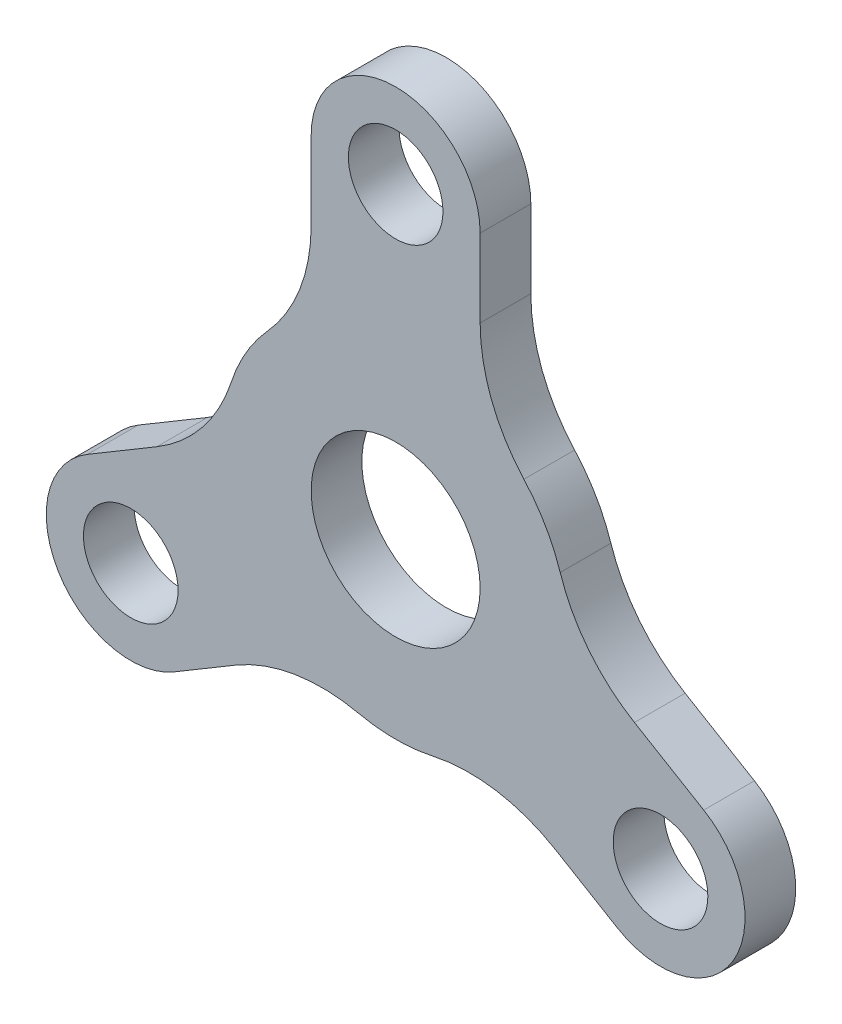
ISO-10303-21;
HEADER;
FILE_DESCRIPTION(('STEP AP214'),'2;1');
FILE_NAME('part.step','',(''),(''),'','','');
FILE_SCHEMA(('AUTOMOTIVE_DESIGN { 1 0 10303 214 1 1 1 1 }'));
ENDSEC;
DATA;
#1=APPLICATION_CONTEXT('core data for automotive mechanical design processes');
#2=APPLICATION_PROTOCOL_DEFINITION('international standard','automotive_design',2000,#1);
#3=PRODUCT_CONTEXT('',#1,'mechanical');
#4=PRODUCT('Part','Part','',(#3));
#5=PRODUCT_RELATED_PRODUCT_CATEGORY('part','',(#4));
#6=PRODUCT_DEFINITION_FORMATION('','',#4);
#7=PRODUCT_DEFINITION_CONTEXT('part definition',#1,'design');
#8=PRODUCT_DEFINITION('design','',#6,#7);
#9=PRODUCT_DEFINITION_SHAPE('','',#8);
#10=(LENGTH_UNIT() NAMED_UNIT(*) SI_UNIT(.MILLI.,.METRE.));
#11=(NAMED_UNIT(*) PLANE_ANGLE_UNIT() SI_UNIT($,.RADIAN.));
#12=(NAMED_UNIT(*) SI_UNIT($,.STERADIAN.) SOLID_ANGLE_UNIT());
#13=UNCERTAINTY_MEASURE_WITH_UNIT(LENGTH_MEASURE(1.E-05),#10,'distance_accuracy_value','');
#14=(GEOMETRIC_REPRESENTATION_CONTEXT(3) GLOBAL_UNCERTAINTY_ASSIGNED_CONTEXT((#13)) GLOBAL_UNIT_ASSIGNED_CONTEXT((#10,
#11,#12)) REPRESENTATION_CONTEXT('',''));
#15=CARTESIAN_POINT('',(0.,0.,0.));
#16=DIRECTION('',(0.,0.,1.));
#17=DIRECTION('',(1.,0.,0.));
#18=AXIS2_PLACEMENT_3D('',#15,#16,#17);
#19=CARTESIAN_POINT('',(-15.6750598084983,-9.05000000000008,3.));
#20=DIRECTION('',(0.,0.,-1.));
#21=DIRECTION('',(-1.,0.,0.));
#22=AXIS2_PLACEMENT_3D('',#19,#20,#21);
#23=CYLINDRICAL_SURFACE('',#22,5.);
#24=CARTESIAN_POINT('',(-15.6750598084983,-9.05000000000008,0.));
#25=DIRECTION('',(0.,0.,1.));
#26=DIRECTION('',(1.,0.,0.));
#27=AXIS2_PLACEMENT_3D('',#24,#25,#26);
#28=CIRCLE('',#27,5.);
#29=CARTESIAN_POINT('',(-18.2317713929619,-4.75311439832654,0.));
#30=VERTEX_POINT('',#29);
#31=CARTESIAN_POINT('',(-13.1183482240346,-13.3468856016736,0.));
#32=VERTEX_POINT('',#31);
#33=EDGE_CURVE('E254',#30,#32,#28,.T.);
#34=ORIENTED_EDGE('',*,*,#33,.T.);
#35=DIRECTION('',(0.,0.,-1.));
#36=VECTOR('',#35,1.);
#37=CARTESIAN_POINT('',(-13.1183482240346,-13.3468856016736,3.));
#38=LINE('',#37,#36);
#39=CARTESIAN_POINT('',(-13.1183482240346,-13.3468856016736,3.));
#40=VERTEX_POINT('',#39);
#41=EDGE_CURVE('E210',#40,#32,#38,.T.);
#42=ORIENTED_EDGE('',*,*,#41,.F.);
#43=CARTESIAN_POINT('',(-15.6750598084983,-9.05000000000008,3.));
#44=DIRECTION('',(0.,0.,1.));
#45=DIRECTION('',(1.,0.,0.));
#46=AXIS2_PLACEMENT_3D('',#43,#44,#45);
#47=CIRCLE('',#46,5.);
#48=CARTESIAN_POINT('',(-18.2317713929619,-4.75311439832654,3.));
#49=VERTEX_POINT('',#48);
#50=EDGE_CURVE('E213',#49,#40,#47,.T.);
#51=ORIENTED_EDGE('',*,*,#50,.F.);
#52=DIRECTION('',(0.,0.,-1.));
#53=VECTOR('',#52,1.);
#54=CARTESIAN_POINT('',(-18.2317713929619,-4.75311439832654,3.));
#55=LINE('',#54,#53);
#56=EDGE_CURVE('E198',#49,#30,#55,.T.);
#57=ORIENTED_EDGE('',*,*,#56,.T.);
#58=EDGE_LOOP('',(#34,#42,#51,#57));
#59=FACE_BOUND('',#58,.T.);
#60=ADVANCED_FACE('F73',(#59),#23,.T.);
#61=CARTESIAN_POINT('',(2.43503335375282,-4.09238954480285,3.));
#62=DIRECTION('',(-0.511342316892728,0.859377120334709,0.));
#63=DIRECTION('',(-0.859377120334709,-0.511342316892728,0.));
#64=AXIS2_PLACEMENT_3D('',#61,#62,#63);
#65=PLANE('',#64);
#66=DIRECTION('',(0.859377120334709,0.511342316892728,0.));
#67=VECTOR('',#66,1.);
#68=CARTESIAN_POINT('',(2.43503335375282,-4.09238954480285,0.));
#69=LINE('',#68,#67);
#70=CARTESIAN_POINT('',(-9.46922520496294,-11.1756025001734,0.));
#71=VERTEX_POINT('',#70);
#72=EDGE_CURVE('E257',#32,#71,#69,.T.);
#73=ORIENTED_EDGE('',*,*,#72,.T.);
#74=DIRECTION('',(0.,0.,1.));
#75=VECTOR('',#74,1.);
#76=CARTESIAN_POINT('',(-9.46922520496294,-11.1756025001734,3.));
#77=LINE('',#76,#75);
#78=CARTESIAN_POINT('',(-9.46922520496294,-11.1756025001734,3.));
#79=VERTEX_POINT('',#78);
#80=EDGE_CURVE('E88',#71,#79,#77,.T.);
#81=ORIENTED_EDGE('',*,*,#80,.T.);
#82=DIRECTION('',(0.859377120334709,0.511342316892728,0.));
#83=VECTOR('',#82,1.);
#84=CARTESIAN_POINT('',(2.43503335375282,-4.09238954480285,3.));
#85=LINE('',#84,#83);
#86=EDGE_CURVE('E216',#40,#79,#85,.T.);
#87=ORIENTED_EDGE('',*,*,#86,.F.);
#88=ORIENTED_EDGE('',*,*,#41,.T.);
#89=EDGE_LOOP('',(#73,#81,#87,#88));
#90=FACE_BOUND('',#89,.T.);
#91=ADVANCED_FACE('F351',(#90),#65,.F.);
#92=CARTESIAN_POINT('',(0.,0.,3.));
#93=DIRECTION('',(0.,0.,-1.));
#94=DIRECTION('',(-1.,0.,0.));
#95=AXIS2_PLACEMENT_3D('',#92,#93,#94);
#96=CYLINDRICAL_SURFACE('',#95,10.2435458358109);
#97=CARTESIAN_POINT('',(0.,0.,0.));
#98=DIRECTION('',(0.,0.,1.));
#99=DIRECTION('',(1.,0.,0.));
#100=AXIS2_PLACEMENT_3D('',#97,#98,#99);
#101=CIRCLE('',#100,10.2435458358109);
#102=CARTESIAN_POINT('',(-2.20410288640831,-10.0036074371442,0.));
#103=VERTEX_POINT('',#102);
#104=CARTESIAN_POINT('',(2.20410288640832,-10.0036074371442,0.));
#105=VERTEX_POINT('',#104);
#106=EDGE_CURVE('E228',#103,#105,#101,.T.);
#107=ORIENTED_EDGE('',*,*,#106,.T.);
#108=DIRECTION('',(0.,0.,-1.));
#109=VECTOR('',#108,1.);
#110=CARTESIAN_POINT('',(2.20410288640832,-10.0036074371442,3.));
#111=LINE('',#110,#109);
#112=CARTESIAN_POINT('',(2.20410288640832,-10.0036074371442,3.));
#113=VERTEX_POINT('',#112);
#114=EDGE_CURVE('E291',#105,#113,#111,.F.);
#115=ORIENTED_EDGE('',*,*,#114,.T.);
#116=CARTESIAN_POINT('',(0.,0.,3.));
#117=DIRECTION('',(0.,0.,1.));
#118=DIRECTION('',(1.,0.,0.));
#119=AXIS2_PLACEMENT_3D('',#116,#117,#118);
#120=CIRCLE('',#119,10.2435458358109);
#121=CARTESIAN_POINT('',(-2.20410288640831,-10.0036074371442,3.));
#122=VERTEX_POINT('',#121);
#123=EDGE_CURVE('E234',#122,#113,#120,.T.);
#124=ORIENTED_EDGE('',*,*,#123,.F.);
#125=DIRECTION('',(0.,0.,-1.));
#126=VECTOR('',#125,1.);
#127=CARTESIAN_POINT('',(-2.20410288640831,-10.0036074371442,3.));
#128=LINE('',#127,#126);
#129=EDGE_CURVE('E288',#122,#103,#128,.T.);
#130=ORIENTED_EDGE('',*,*,#129,.T.);
#131=EDGE_LOOP('',(#107,#115,#124,#130));
#132=FACE_BOUND('',#131,.T.);
#133=ADVANCED_FACE('F356',(#132),#96,.T.);
#134=CARTESIAN_POINT('',(-2.43503335375282,-4.09238954480286,3.));
#135=DIRECTION('',(-0.511342316892728,-0.859377120334709,0.));
#136=DIRECTION('',(0.859377120334709,-0.511342316892728,0.));
#137=AXIS2_PLACEMENT_3D('',#134,#135,#136);
#138=PLANE('',#137);
#139=DIRECTION('',(-0.859377120334709,0.511342316892728,0.));
#140=VECTOR('',#139,1.);
#141=CARTESIAN_POINT('',(-2.43503335375282,-4.09238954480286,3.));
#142=LINE('',#141,#140);
#143=CARTESIAN_POINT('',(13.1183482240346,-13.3468856016736,3.));
#144=VERTEX_POINT('',#143);
#145=CARTESIAN_POINT('',(9.46922520496294,-11.1756025001734,3.));
#146=VERTEX_POINT('',#145);
#147=EDGE_CURVE('E240',#144,#146,#142,.T.);
#148=ORIENTED_EDGE('',*,*,#147,.T.);
#149=DIRECTION('',(0.,0.,-1.));
#150=VECTOR('',#149,1.);
#151=CARTESIAN_POINT('',(9.46922520496294,-11.1756025001734,3.));
#152=LINE('',#151,#150);
#153=CARTESIAN_POINT('',(9.46922520496294,-11.1756025001734,0.));
#154=VERTEX_POINT('',#153);
#155=EDGE_CURVE('E209',#146,#154,#152,.T.);
#156=ORIENTED_EDGE('',*,*,#155,.T.);
#157=DIRECTION('',(-0.859377120334709,0.511342316892728,0.));
#158=VECTOR('',#157,1.);
#159=CARTESIAN_POINT('',(-2.43503335375282,-4.09238954480286,0.));
#160=LINE('',#159,#158);
#161=CARTESIAN_POINT('',(13.1183482240346,-13.3468856016736,0.));
#162=VERTEX_POINT('',#161);
#163=EDGE_CURVE('E259',#162,#154,#160,.T.);
#164=ORIENTED_EDGE('',*,*,#163,.F.);
#165=DIRECTION('',(0.,0.,-1.));
#166=VECTOR('',#165,1.);
#167=CARTESIAN_POINT('',(13.1183482240346,-13.3468856016736,3.));
#168=LINE('',#167,#166);
#169=EDGE_CURVE('E278',#144,#162,#168,.T.);
#170=ORIENTED_EDGE('',*,*,#169,.F.);
#171=EDGE_LOOP('',(#148,#156,#164,#170));
#172=FACE_BOUND('',#171,.T.);
#173=ADVANCED_FACE('F415',(#172),#138,.T.);
#174=CARTESIAN_POINT('',(2.67838981517445,4.50138165854423,3.));
#175=DIRECTION('',(-0.511342316892728,-0.859377120334709,0.));
#176=DIRECTION('',(0.859377120334709,-0.511342316892728,0.));
#177=AXIS2_PLACEMENT_3D('',#174,#175,#176);
#178=PLANE('',#177);
#179=DIRECTION('',(-0.859377120334709,0.511342316892728,0.));
#180=VECTOR('',#179,1.);
#181=CARTESIAN_POINT('',(2.67838981517445,4.50138165854423,0.));
#182=LINE('',#181,#180);
#183=CARTESIAN_POINT('',(18.2317713929619,-4.75311439832654,0.));
#184=VERTEX_POINT('',#183);
#185=CARTESIAN_POINT('',(14.1312068435024,-2.31321679380084,0.));
#186=VERTEX_POINT('',#185);
#187=EDGE_CURVE('E262',#184,#186,#182,.T.);
#188=ORIENTED_EDGE('',*,*,#187,.T.);
#189=DIRECTION('',(0.,0.,1.));
#190=VECTOR('',#189,1.);
#191=CARTESIAN_POINT('',(14.1312068435024,-2.31321679380084,3.));
#192=LINE('',#191,#190);
#193=CARTESIAN_POINT('',(14.1312068435024,-2.31321679380084,3.));
#194=VERTEX_POINT('',#193);
#195=EDGE_CURVE('E298',#186,#194,#192,.T.);
#196=ORIENTED_EDGE('',*,*,#195,.T.);
#197=DIRECTION('',(-0.859377120334709,0.511342316892728,0.));
#198=VECTOR('',#197,1.);
#199=CARTESIAN_POINT('',(2.67838981517445,4.50138165854423,3.));
#200=LINE('',#199,#198);
#201=CARTESIAN_POINT('',(18.2317713929619,-4.75311439832654,3.));
#202=VERTEX_POINT('',#201);
#203=EDGE_CURVE('E243',#202,#194,#200,.T.);
#204=ORIENTED_EDGE('',*,*,#203,.F.);
#205=DIRECTION('',(0.,0.,-1.));
#206=VECTOR('',#205,1.);
#207=CARTESIAN_POINT('',(18.2317713929619,-4.75311439832654,3.));
#208=LINE('',#207,#206);
#209=EDGE_CURVE('E276',#202,#184,#208,.T.);
#210=ORIENTED_EDGE('',*,*,#209,.T.);
#211=EDGE_LOOP('',(#188,#196,#204,#210));
#212=FACE_BOUND('',#211,.T.);
#213=ADVANCED_FACE('F413',(#212),#178,.F.);
#214=CARTESIAN_POINT('',(9.73807905119151,3.17805721834967,3.));
#215=VERTEX_POINT('',#214);
#216=CARTESIAN_POINT('',(7.59023092018547,6.87885352864995,3.));
#217=VERTEX_POINT('',#216);
#218=EDGE_CURVE('E239',#215,#217,#120,.T.);
#219=ORIENTED_EDGE('',*,*,#218,.F.);
#220=DIRECTION('',(0.,0.,-1.));
#221=VECTOR('',#220,1.);
#222=CARTESIAN_POINT('',(9.73807905119151,3.17805721834967,3.));
#223=LINE('',#222,#221);
#224=CARTESIAN_POINT('',(9.73807905119151,3.17805721834967,0.));
#225=VERTEX_POINT('',#224);
#226=EDGE_CURVE('E295',#215,#225,#223,.T.);
#227=ORIENTED_EDGE('',*,*,#226,.T.);
#228=CARTESIAN_POINT('',(7.59023092018547,6.87885352864995,0.));
#229=VERTEX_POINT('',#228);
#230=EDGE_CURVE('E227',#225,#229,#101,.T.);
#231=ORIENTED_EDGE('',*,*,#230,.T.);
#232=DIRECTION('',(0.,0.,-1.));
#233=VECTOR('',#232,1.);
#234=CARTESIAN_POINT('',(7.59023092018547,6.87885352864995,3.));
#235=LINE('',#234,#233);
#236=EDGE_CURVE('E293',#229,#217,#235,.F.);
#237=ORIENTED_EDGE('',*,*,#236,.T.);
#238=EDGE_LOOP('',(#219,#227,#231,#237));
#239=FACE_BOUND('',#238,.T.);
#240=ADVANCED_FACE('F407',(#239),#96,.T.);
#241=CARTESIAN_POINT('',(5.,0.,3.));
#242=DIRECTION('',(1.,0.,0.));
#243=DIRECTION('',(0.,1.,0.));
#244=AXIS2_PLACEMENT_3D('',#241,#242,#243);
#245=PLANE('',#244);
#246=DIRECTION('',(0.,-1.,0.));
#247=VECTOR('',#246,1.);
#248=CARTESIAN_POINT('',(5.,0.,3.));
#249=LINE('',#248,#247);
#250=CARTESIAN_POINT('',(5.,18.2,3.));
#251=VERTEX_POINT('',#250);
#252=CARTESIAN_POINT('',(5.,13.5941585986989,3.));
#253=VERTEX_POINT('',#252);
#254=EDGE_CURVE('E246',#251,#253,#249,.T.);
#255=ORIENTED_EDGE('',*,*,#254,.T.);
#256=DIRECTION('',(0.,0.,-1.));
#257=VECTOR('',#256,1.);
#258=CARTESIAN_POINT('',(5.,13.5941585986989,3.));
#259=LINE('',#258,#257);
#260=CARTESIAN_POINT('',(5.,13.5941585986989,0.));
#261=VERTEX_POINT('',#260);
#262=EDGE_CURVE('E300',#253,#261,#259,.T.);
#263=ORIENTED_EDGE('',*,*,#262,.T.);
#264=DIRECTION('',(0.,-1.,0.));
#265=VECTOR('',#264,1.);
#266=CARTESIAN_POINT('',(5.,0.,0.));
#267=LINE('',#266,#265);
#268=CARTESIAN_POINT('',(5.,18.2,0.));
#269=VERTEX_POINT('',#268);
#270=EDGE_CURVE('E265',#269,#261,#267,.T.);
#271=ORIENTED_EDGE('',*,*,#270,.F.);
#272=DIRECTION('',(0.,0.,-1.));
#273=VECTOR('',#272,1.);
#274=CARTESIAN_POINT('',(5.,18.2,3.));
#275=LINE('',#274,#273);
#276=EDGE_CURVE('E274',#251,#269,#275,.T.);
#277=ORIENTED_EDGE('',*,*,#276,.F.);
#278=EDGE_LOOP('',(#255,#263,#271,#277));
#279=FACE_BOUND('',#278,.T.);
#280=ADVANCED_FACE('F387',(#279),#245,.T.);
#281=CARTESIAN_POINT('',(0.,18.2,3.));
#282=DIRECTION('',(0.,0.,-1.));
#283=DIRECTION('',(-1.,0.,0.));
#284=AXIS2_PLACEMENT_3D('',#281,#282,#283);
#285=CYLINDRICAL_SURFACE('',#284,5.);
#286=CARTESIAN_POINT('',(0.,18.2,0.));
#287=DIRECTION('',(0.,0.,1.));
#288=DIRECTION('',(1.,0.,0.));
#289=AXIS2_PLACEMENT_3D('',#286,#287,#288);
#290=CIRCLE('',#289,5.);
#291=CARTESIAN_POINT('',(-5.,18.2,0.));
#292=VERTEX_POINT('',#291);
#293=EDGE_CURVE('E268',#269,#292,#290,.T.);
#294=ORIENTED_EDGE('',*,*,#293,.T.);
#295=DIRECTION('',(0.,0.,-1.));
#296=VECTOR('',#295,1.);
#297=CARTESIAN_POINT('',(-5.,18.2,3.));
#298=LINE('',#297,#296);
#299=CARTESIAN_POINT('',(-5.,18.2,3.));
#300=VERTEX_POINT('',#299);
#301=EDGE_CURVE('E237',#300,#292,#298,.T.);
#302=ORIENTED_EDGE('',*,*,#301,.F.);
#303=CARTESIAN_POINT('',(0.,18.2,3.));
#304=DIRECTION('',(0.,0.,1.));
#305=DIRECTION('',(1.,0.,0.));
#306=AXIS2_PLACEMENT_3D('',#303,#304,#305);
#307=CIRCLE('',#306,5.);
#308=EDGE_CURVE('E249',#251,#300,#307,.T.);
#309=ORIENTED_EDGE('',*,*,#308,.F.);
#310=ORIENTED_EDGE('',*,*,#276,.T.);
#311=EDGE_LOOP('',(#294,#302,#309,#310));
#312=FACE_BOUND('',#311,.T.);
#313=ADVANCED_FACE('F393',(#312),#285,.T.);
#314=CARTESIAN_POINT('',(-5.,0.,3.));
#315=DIRECTION('',(1.,0.,0.));
#316=DIRECTION('',(0.,1.,0.));
#317=AXIS2_PLACEMENT_3D('',#314,#315,#316);
#318=PLANE('',#317);
#319=DIRECTION('',(0.,-1.,0.));
#320=VECTOR('',#319,1.);
#321=CARTESIAN_POINT('',(-5.,0.,0.));
#322=LINE('',#321,#320);
#323=CARTESIAN_POINT('',(-5.,13.5941585986989,0.));
#324=VERTEX_POINT('',#323);
#325=EDGE_CURVE('E225',#292,#324,#322,.T.);
#326=ORIENTED_EDGE('',*,*,#325,.T.);
#327=DIRECTION('',(0.,0.,1.));
#328=VECTOR('',#327,1.);
#329=CARTESIAN_POINT('',(-5.,13.5941585986989,3.));
#330=LINE('',#329,#328);
#331=CARTESIAN_POINT('',(-5.,13.5941585986989,3.));
#332=VERTEX_POINT('',#331);
#333=EDGE_CURVE('E308',#324,#332,#330,.T.);
#334=ORIENTED_EDGE('',*,*,#333,.T.);
#335=DIRECTION('',(0.,-1.,0.));
#336=VECTOR('',#335,1.);
#337=CARTESIAN_POINT('',(-5.,0.,3.));
#338=LINE('',#337,#336);
#339=EDGE_CURVE('E238',#300,#332,#338,.T.);
#340=ORIENTED_EDGE('',*,*,#339,.F.);
#341=ORIENTED_EDGE('',*,*,#301,.T.);
#342=EDGE_LOOP('',(#326,#334,#340,#341));
#343=FACE_BOUND('',#342,.T.);
#344=ADVANCED_FACE('F399',(#343),#318,.F.);
#345=CARTESIAN_POINT('',(-7.59023092018547,6.87885352864995,3.));
#346=VERTEX_POINT('',#345);
#347=CARTESIAN_POINT('',(-9.73807905119151,3.17805721834968,3.));
#348=VERTEX_POINT('',#347);
#349=EDGE_CURVE('E235',#346,#348,#120,.T.);
#350=ORIENTED_EDGE('',*,*,#349,.F.);
#351=DIRECTION('',(0.,0.,-1.));
#352=VECTOR('',#351,1.);
#353=CARTESIAN_POINT('',(-7.59023092018547,6.87885352864995,3.));
#354=LINE('',#353,#352);
#355=CARTESIAN_POINT('',(-7.59023092018547,6.87885352864995,0.));
#356=VERTEX_POINT('',#355);
#357=EDGE_CURVE('E305',#346,#356,#354,.T.);
#358=ORIENTED_EDGE('',*,*,#357,.T.);
#359=CARTESIAN_POINT('',(-9.73807905119151,3.17805721834968,0.));
#360=VERTEX_POINT('',#359);
#361=EDGE_CURVE('E222',#356,#360,#101,.T.);
#362=ORIENTED_EDGE('',*,*,#361,.T.);
#363=DIRECTION('',(0.,0.,-1.));
#364=VECTOR('',#363,1.);
#365=CARTESIAN_POINT('',(-9.73807905119151,3.17805721834968,3.));
#366=LINE('',#365,#364);
#367=EDGE_CURVE('E303',#360,#348,#366,.F.);
#368=ORIENTED_EDGE('',*,*,#367,.T.);
#369=EDGE_LOOP('',(#350,#358,#362,#368));
#370=FACE_BOUND('',#369,.T.);
#371=ADVANCED_FACE('F337',(#370),#96,.T.);
#372=CARTESIAN_POINT('',(-2.67838981517446,4.50138165854424,3.));
#373=DIRECTION('',(-0.511342316892728,0.859377120334709,0.));
#374=DIRECTION('',(-0.859377120334709,-0.511342316892728,0.));
#375=AXIS2_PLACEMENT_3D('',#372,#373,#374);
#376=PLANE('',#375);
#377=DIRECTION('',(0.859377120334709,0.511342316892728,0.));
#378=VECTOR('',#377,1.);
#379=CARTESIAN_POINT('',(-2.67838981517446,4.50138165854424,3.));
#380=LINE('',#379,#378);
#381=CARTESIAN_POINT('',(-14.1312068435023,-2.31321679380083,3.));
#382=VERTEX_POINT('',#381);
#383=EDGE_CURVE('E203',#49,#382,#380,.T.);
#384=ORIENTED_EDGE('',*,*,#383,.T.);
#385=DIRECTION('',(0.,0.,-1.));
#386=VECTOR('',#385,1.);
#387=CARTESIAN_POINT('',(-14.1312068435023,-2.31321679380083,3.));
#388=LINE('',#387,#386);
#389=CARTESIAN_POINT('',(-14.1312068435023,-2.31321679380083,0.));
#390=VERTEX_POINT('',#389);
#391=EDGE_CURVE('E310',#382,#390,#388,.T.);
#392=ORIENTED_EDGE('',*,*,#391,.T.);
#393=DIRECTION('',(0.859377120334709,0.511342316892728,0.));
#394=VECTOR('',#393,1.);
#395=CARTESIAN_POINT('',(-2.67838981517446,4.50138165854424,0.));
#396=LINE('',#395,#394);
#397=EDGE_CURVE('E206',#30,#390,#396,.T.);
#398=ORIENTED_EDGE('',*,*,#397,.F.);
#399=ORIENTED_EDGE('',*,*,#56,.F.);
#400=EDGE_LOOP('',(#384,#392,#398,#399));
#401=FACE_BOUND('',#400,.T.);
#402=ADVANCED_FACE('F200',(#401),#376,.T.);
#403=CARTESIAN_POINT('',(0.,0.,0.));
#404=DIRECTION('',(0.,0.,1.));
#405=DIRECTION('',(1.,0.,0.));
#406=AXIS2_PLACEMENT_3D('',#403,#404,#405);
#407=PLANE('',#406);
#408=CARTESIAN_POINT('',(0.,0.,0.));
#409=DIRECTION('',(0.,0.,1.));
#410=DIRECTION('',(1.,0.,0.));
#411=AXIS2_PLACEMENT_3D('',#408,#409,#410);
#412=CIRCLE('',#411,5.);
#413=CARTESIAN_POINT('',(5.,0.,0.));
#414=VERTEX_POINT('',#413);
#415=EDGE_CURVE('E630',#414,#414,#412,.T.);
#416=ORIENTED_EDGE('',*,*,#415,.T.);
#417=EDGE_LOOP('',(#416));
#418=FACE_BOUND('',#417,.T.);
#419=CARTESIAN_POINT('',(0.,18.2,0.));
#420=DIRECTION('',(0.,0.,1.));
#421=DIRECTION('',(1.,0.,0.));
#422=AXIS2_PLACEMENT_3D('',#419,#420,#421);
#423=CIRCLE('',#422,2.8);
#424=CARTESIAN_POINT('',(2.8,18.2,0.));
#425=VERTEX_POINT('',#424);
#426=EDGE_CURVE('E230',#425,#425,#423,.T.);
#427=ORIENTED_EDGE('',*,*,#426,.T.);
#428=EDGE_LOOP('',(#427));
#429=FACE_BOUND('',#428,.T.);
#430=CARTESIAN_POINT('',(15.6750598084983,-9.05000000000008,0.));
#431=DIRECTION('',(0.,0.,1.));
#432=DIRECTION('',(1.,0.,0.));
#433=AXIS2_PLACEMENT_3D('',#430,#431,#432);
#434=CIRCLE('',#433,2.8);
#435=CARTESIAN_POINT('',(18.4750598084983,-9.05000000000008,0.));
#436=VERTEX_POINT('',#435);
#437=EDGE_CURVE('E637',#436,#436,#434,.T.);
#438=ORIENTED_EDGE('',*,*,#437,.T.);
#439=EDGE_LOOP('',(#438));
#440=FACE_BOUND('',#439,.T.);
#441=CARTESIAN_POINT('',(-15.6750598084983,-9.05000000000008,0.));
#442=DIRECTION('',(0.,0.,1.));
#443=DIRECTION('',(1.,0.,0.));
#444=AXIS2_PLACEMENT_3D('',#441,#442,#443);
#445=CIRCLE('',#444,2.8);
#446=CARTESIAN_POINT('',(-12.8750598084983,-9.05000000000008,0.));
#447=VERTEX_POINT('',#446);
#448=EDGE_CURVE('E640',#447,#447,#445,.T.);
#449=ORIENTED_EDGE('',*,*,#448,.T.);
#450=EDGE_LOOP('',(#449));
#451=FACE_BOUND('',#450,.T.);
#452=ORIENTED_EDGE('',*,*,#397,.T.);
#453=CARTESIAN_POINT('',(-19.2446300124296,6.28055440954626,0.));
#454=DIRECTION('',(0.,0.,1.));
#455=DIRECTION('',(1.,0.,0.));
#456=AXIS2_PLACEMENT_3D('',#453,#454,#455);
#457=CIRCLE('',#456,10.);
#458=EDGE_CURVE('E329',#390,#360,#457,.T.);
#459=ORIENTED_EDGE('',*,*,#458,.T.);
#460=ORIENTED_EDGE('',*,*,#361,.F.);
#461=CARTESIAN_POINT('',(-15.,13.5941585986989,0.));
#462=DIRECTION('',(0.,0.,1.));
#463=DIRECTION('',(1.,0.,0.));
#464=AXIS2_PLACEMENT_3D('',#461,#462,#463);
#465=CIRCLE('',#464,10.);
#466=EDGE_CURVE('E325',#356,#324,#465,.T.);
#467=ORIENTED_EDGE('',*,*,#466,.T.);
#468=ORIENTED_EDGE('',*,*,#325,.F.);
#469=ORIENTED_EDGE('',*,*,#293,.F.);
#470=ORIENTED_EDGE('',*,*,#270,.T.);
#471=CARTESIAN_POINT('',(15.,13.5941585986989,0.));
#472=DIRECTION('',(0.,0.,1.));
#473=DIRECTION('',(1.,0.,0.));
#474=AXIS2_PLACEMENT_3D('',#471,#472,#473);
#475=CIRCLE('',#474,10.);
#476=EDGE_CURVE('E321',#261,#229,#475,.T.);
#477=ORIENTED_EDGE('',*,*,#476,.T.);
#478=ORIENTED_EDGE('',*,*,#230,.F.);
#479=CARTESIAN_POINT('',(19.2446300124296,6.28055440954625,0.));
#480=DIRECTION('',(0.,0.,1.));
#481=DIRECTION('',(1.,0.,0.));
#482=AXIS2_PLACEMENT_3D('',#479,#480,#481);
#483=CIRCLE('',#482,10.);
#484=EDGE_CURVE('E317',#225,#186,#483,.T.);
#485=ORIENTED_EDGE('',*,*,#484,.T.);
#486=ORIENTED_EDGE('',*,*,#187,.F.);
#487=CARTESIAN_POINT('',(15.6750598084983,-9.05000000000008,0.));
#488=DIRECTION('',(0.,0.,1.));
#489=DIRECTION('',(1.,0.,0.));
#490=AXIS2_PLACEMENT_3D('',#487,#488,#489);
#491=CIRCLE('',#490,5.);
#492=EDGE_CURVE('E283',#162,#184,#491,.T.);
#493=ORIENTED_EDGE('',*,*,#492,.F.);
#494=ORIENTED_EDGE('',*,*,#163,.T.);
#495=CARTESIAN_POINT('',(4.35580203603567,-19.7693737035204,0.));
#496=DIRECTION('',(0.,0.,1.));
#497=DIRECTION('',(1.,0.,0.));
#498=AXIS2_PLACEMENT_3D('',#495,#496,#497);
#499=CIRCLE('',#498,10.);
#500=EDGE_CURVE('E313',#154,#105,#499,.T.);
#501=ORIENTED_EDGE('',*,*,#500,.T.);
#502=ORIENTED_EDGE('',*,*,#106,.F.);
#503=CARTESIAN_POINT('',(-4.35580203603566,-19.7693737035204,0.));
#504=DIRECTION('',(0.,0.,1.));
#505=DIRECTION('',(1.,0.,0.));
#506=AXIS2_PLACEMENT_3D('',#503,#504,#505);
#507=CIRCLE('',#506,10.);
#508=EDGE_CURVE('E81',#103,#71,#507,.T.);
#509=ORIENTED_EDGE('',*,*,#508,.T.);
#510=ORIENTED_EDGE('',*,*,#72,.F.);
#511=ORIENTED_EDGE('',*,*,#33,.F.);
#512=EDGE_LOOP('',(#452,#459,#460,#467,#468,#469,#470,#477,#478,#485,#486,#493,#494,#501,#502,
#509,#510,#511));
#513=FACE_BOUND('',#512,.T.);
#514=ADVANCED_FACE('F332',(#418,#429,#440,#451,#513),#407,.F.);
#515=CARTESIAN_POINT('',(0.,0.,3.));
#516=DIRECTION('',(0.,0.,1.));
#517=DIRECTION('',(1.,0.,0.));
#518=AXIS2_PLACEMENT_3D('',#515,#516,#517);
#519=PLANE('',#518);
#520=CARTESIAN_POINT('',(0.,0.,3.));
#521=DIRECTION('',(0.,0.,1.));
#522=DIRECTION('',(1.,0.,0.));
#523=AXIS2_PLACEMENT_3D('',#520,#521,#522);
#524=CIRCLE('',#523,5.);
#525=CARTESIAN_POINT('',(5.,0.,3.));
#526=VERTEX_POINT('',#525);
#527=EDGE_CURVE('E654',#526,#526,#524,.T.);
#528=ORIENTED_EDGE('',*,*,#527,.F.);
#529=EDGE_LOOP('',(#528));
#530=FACE_BOUND('',#529,.T.);
#531=CARTESIAN_POINT('',(0.,18.2,3.));
#532=DIRECTION('',(0.,0.,1.));
#533=DIRECTION('',(1.,0.,0.));
#534=AXIS2_PLACEMENT_3D('',#531,#532,#533);
#535=CIRCLE('',#534,2.8);
#536=CARTESIAN_POINT('',(2.8,18.2,3.));
#537=VERTEX_POINT('',#536);
#538=EDGE_CURVE('E642',#537,#537,#535,.T.);
#539=ORIENTED_EDGE('',*,*,#538,.F.);
#540=EDGE_LOOP('',(#539));
#541=FACE_BOUND('',#540,.T.);
#542=CARTESIAN_POINT('',(15.6750598084983,-9.05000000000008,3.));
#543=DIRECTION('',(0.,0.,1.));
#544=DIRECTION('',(1.,0.,0.));
#545=AXIS2_PLACEMENT_3D('',#542,#543,#544);
#546=CIRCLE('',#545,2.8);
#547=CARTESIAN_POINT('',(18.4750598084983,-9.05000000000008,3.));
#548=VERTEX_POINT('',#547);
#549=EDGE_CURVE('E645',#548,#548,#546,.T.);
#550=ORIENTED_EDGE('',*,*,#549,.F.);
#551=EDGE_LOOP('',(#550));
#552=FACE_BOUND('',#551,.T.);
#553=CARTESIAN_POINT('',(-15.6750598084983,-9.05000000000008,3.));
#554=DIRECTION('',(0.,0.,1.));
#555=DIRECTION('',(1.,0.,0.));
#556=AXIS2_PLACEMENT_3D('',#553,#554,#555);
#557=CIRCLE('',#556,2.8);
#558=CARTESIAN_POINT('',(-12.8750598084983,-9.05000000000008,3.));
#559=VERTEX_POINT('',#558);
#560=EDGE_CURVE('E648',#559,#559,#557,.T.);
#561=ORIENTED_EDGE('',*,*,#560,.F.);
#562=EDGE_LOOP('',(#561));
#563=FACE_BOUND('',#562,.T.);
#564=ORIENTED_EDGE('',*,*,#383,.F.);
#565=ORIENTED_EDGE('',*,*,#50,.T.);
#566=ORIENTED_EDGE('',*,*,#86,.T.);
#567=CARTESIAN_POINT('',(-4.35580203603566,-19.7693737035204,3.));
#568=DIRECTION('',(0.,0.,1.));
#569=DIRECTION('',(1.,0.,0.));
#570=AXIS2_PLACEMENT_3D('',#567,#568,#569);
#571=CIRCLE('',#570,10.);
#572=EDGE_CURVE('E12',#79,#122,#571,.F.);
#573=ORIENTED_EDGE('',*,*,#572,.T.);
#574=ORIENTED_EDGE('',*,*,#123,.T.);
#575=CARTESIAN_POINT('',(4.35580203603567,-19.7693737035204,3.));
#576=DIRECTION('',(0.,0.,1.));
#577=DIRECTION('',(1.,0.,0.));
#578=AXIS2_PLACEMENT_3D('',#575,#576,#577);
#579=CIRCLE('',#578,10.);
#580=EDGE_CURVE('E315',#113,#146,#579,.F.);
#581=ORIENTED_EDGE('',*,*,#580,.T.);
#582=ORIENTED_EDGE('',*,*,#147,.F.);
#583=CARTESIAN_POINT('',(15.6750598084983,-9.05000000000008,3.));
#584=DIRECTION('',(0.,0.,1.));
#585=DIRECTION('',(1.,0.,0.));
#586=AXIS2_PLACEMENT_3D('',#583,#584,#585);
#587=CIRCLE('',#586,5.);
#588=EDGE_CURVE('E255',#144,#202,#587,.T.);
#589=ORIENTED_EDGE('',*,*,#588,.T.);
#590=ORIENTED_EDGE('',*,*,#203,.T.);
#591=CARTESIAN_POINT('',(19.2446300124296,6.28055440954625,3.));
#592=DIRECTION('',(0.,0.,1.));
#593=DIRECTION('',(1.,0.,0.));
#594=AXIS2_PLACEMENT_3D('',#591,#592,#593);
#595=CIRCLE('',#594,10.);
#596=EDGE_CURVE('E319',#194,#215,#595,.F.);
#597=ORIENTED_EDGE('',*,*,#596,.T.);
#598=ORIENTED_EDGE('',*,*,#218,.T.);
#599=CARTESIAN_POINT('',(15.,13.5941585986989,3.));
#600=DIRECTION('',(0.,0.,1.));
#601=DIRECTION('',(1.,0.,0.));
#602=AXIS2_PLACEMENT_3D('',#599,#600,#601);
#603=CIRCLE('',#602,10.);
#604=EDGE_CURVE('E323',#217,#253,#603,.F.);
#605=ORIENTED_EDGE('',*,*,#604,.T.);
#606=ORIENTED_EDGE('',*,*,#254,.F.);
#607=ORIENTED_EDGE('',*,*,#308,.T.);
#608=ORIENTED_EDGE('',*,*,#339,.T.);
#609=CARTESIAN_POINT('',(-15.,13.5941585986989,3.));
#610=DIRECTION('',(0.,0.,1.));
#611=DIRECTION('',(1.,0.,0.));
#612=AXIS2_PLACEMENT_3D('',#609,#610,#611);
#613=CIRCLE('',#612,10.);
#614=EDGE_CURVE('E327',#332,#346,#613,.F.);
#615=ORIENTED_EDGE('',*,*,#614,.T.);
#616=ORIENTED_EDGE('',*,*,#349,.T.);
#617=CARTESIAN_POINT('',(-19.2446300124296,6.28055440954626,3.));
#618=DIRECTION('',(0.,0.,1.));
#619=DIRECTION('',(1.,0.,0.));
#620=AXIS2_PLACEMENT_3D('',#617,#618,#619);
#621=CIRCLE('',#620,10.);
#622=EDGE_CURVE('E221',#348,#382,#621,.F.);
#623=ORIENTED_EDGE('',*,*,#622,.T.);
#624=EDGE_LOOP('',(#564,#565,#566,#573,#574,#581,#582,#589,#590,#597,#598,#605,#606,#607,#608,
#615,#616,#623));
#625=FACE_BOUND('',#624,.T.);
#626=ADVANCED_FACE('F218',(#530,#541,#552,#563,#625),#519,.T.);
#627=CARTESIAN_POINT('',(15.6750598084983,-9.05000000000008,3.));
#628=DIRECTION('',(0.,0.,-1.));
#629=DIRECTION('',(-1.,0.,0.));
#630=AXIS2_PLACEMENT_3D('',#627,#628,#629);
#631=CYLINDRICAL_SURFACE('',#630,5.);
#632=ORIENTED_EDGE('',*,*,#169,.T.);
#633=ORIENTED_EDGE('',*,*,#492,.T.);
#634=ORIENTED_EDGE('',*,*,#209,.F.);
#635=ORIENTED_EDGE('',*,*,#588,.F.);
#636=EDGE_LOOP('',(#632,#633,#634,#635));
#637=FACE_BOUND('',#636,.T.);
#638=ADVANCED_FACE('F362',(#637),#631,.T.);
#639=CARTESIAN_POINT('',(-15.6750598084983,-9.05000000000008,-7.));
#640=DIRECTION('',(0.,0.,1.));
#641=DIRECTION('',(1.,0.,0.));
#642=AXIS2_PLACEMENT_3D('',#639,#640,#641);
#643=CYLINDRICAL_SURFACE('',#642,2.8);
#644=ORIENTED_EDGE('',*,*,#560,.T.);
#645=EDGE_LOOP('',(#644));
#646=FACE_BOUND('',#645,.T.);
#647=ORIENTED_EDGE('',*,*,#448,.F.);
#648=EDGE_LOOP('',(#647));
#649=FACE_BOUND('',#648,.T.);
#650=ADVANCED_FACE('F365',(#646,#649),#643,.F.);
#651=CARTESIAN_POINT('',(15.6750598084983,-9.05000000000008,-7.));
#652=DIRECTION('',(0.,0.,1.));
#653=DIRECTION('',(1.,0.,0.));
#654=AXIS2_PLACEMENT_3D('',#651,#652,#653);
#655=CYLINDRICAL_SURFACE('',#654,2.8);
#656=ORIENTED_EDGE('',*,*,#549,.T.);
#657=EDGE_LOOP('',(#656));
#658=FACE_BOUND('',#657,.T.);
#659=ORIENTED_EDGE('',*,*,#437,.F.);
#660=EDGE_LOOP('',(#659));
#661=FACE_BOUND('',#660,.T.);
#662=ADVANCED_FACE('F476',(#658,#661),#655,.F.);
#663=CARTESIAN_POINT('',(0.,18.2,-7.));
#664=DIRECTION('',(0.,0.,1.));
#665=DIRECTION('',(1.,0.,0.));
#666=AXIS2_PLACEMENT_3D('',#663,#664,#665);
#667=CYLINDRICAL_SURFACE('',#666,2.8);
#668=ORIENTED_EDGE('',*,*,#538,.T.);
#669=EDGE_LOOP('',(#668));
#670=FACE_BOUND('',#669,.T.);
#671=ORIENTED_EDGE('',*,*,#426,.F.);
#672=EDGE_LOOP('',(#671));
#673=FACE_BOUND('',#672,.T.);
#674=ADVANCED_FACE('F486',(#670,#673),#667,.F.);
#675=CARTESIAN_POINT('',(0.,0.,-7.));
#676=DIRECTION('',(0.,0.,1.));
#677=DIRECTION('',(1.,0.,0.));
#678=AXIS2_PLACEMENT_3D('',#675,#676,#677);
#679=CYLINDRICAL_SURFACE('',#678,5.);
#680=ORIENTED_EDGE('',*,*,#527,.T.);
#681=EDGE_LOOP('',(#680));
#682=FACE_BOUND('',#681,.T.);
#683=ORIENTED_EDGE('',*,*,#415,.F.);
#684=EDGE_LOOP('',(#683));
#685=FACE_BOUND('',#684,.T.);
#686=ADVANCED_FACE('F371',(#682,#685),#679,.F.);
#687=CARTESIAN_POINT('',(4.35580203603567,-19.7693737035204,3.));
#688=DIRECTION('',(0.,0.,-1.));
#689=DIRECTION('',(-1.,0.,0.));
#690=AXIS2_PLACEMENT_3D('',#687,#688,#689);
#691=CYLINDRICAL_SURFACE('',#690,10.);
#692=ORIENTED_EDGE('',*,*,#580,.F.);
#693=ORIENTED_EDGE('',*,*,#114,.F.);
#694=ORIENTED_EDGE('',*,*,#500,.F.);
#695=ORIENTED_EDGE('',*,*,#155,.F.);
#696=EDGE_LOOP('',(#692,#693,#694,#695));
#697=FACE_BOUND('',#696,.T.);
#698=ADVANCED_FACE('F367',(#697),#691,.F.);
#699=CARTESIAN_POINT('',(19.2446300124296,6.28055440954625,3.));
#700=DIRECTION('',(0.,0.,-1.));
#701=DIRECTION('',(-1.,0.,0.));
#702=AXIS2_PLACEMENT_3D('',#699,#700,#701);
#703=CYLINDRICAL_SURFACE('',#702,10.);
#704=ORIENTED_EDGE('',*,*,#596,.F.);
#705=ORIENTED_EDGE('',*,*,#195,.F.);
#706=ORIENTED_EDGE('',*,*,#484,.F.);
#707=ORIENTED_EDGE('',*,*,#226,.F.);
#708=EDGE_LOOP('',(#704,#705,#706,#707));
#709=FACE_BOUND('',#708,.T.);
#710=ADVANCED_FACE('F370',(#709),#703,.F.);
#711=CARTESIAN_POINT('',(15.,13.5941585986989,3.));
#712=DIRECTION('',(0.,0.,-1.));
#713=DIRECTION('',(-1.,0.,0.));
#714=AXIS2_PLACEMENT_3D('',#711,#712,#713);
#715=CYLINDRICAL_SURFACE('',#714,10.);
#716=ORIENTED_EDGE('',*,*,#604,.F.);
#717=ORIENTED_EDGE('',*,*,#236,.F.);
#718=ORIENTED_EDGE('',*,*,#476,.F.);
#719=ORIENTED_EDGE('',*,*,#262,.F.);
#720=EDGE_LOOP('',(#716,#717,#718,#719));
#721=FACE_BOUND('',#720,.T.);
#722=ADVANCED_FACE('F347',(#721),#715,.F.);
#723=CARTESIAN_POINT('',(-15.,13.5941585986989,3.));
#724=DIRECTION('',(0.,0.,-1.));
#725=DIRECTION('',(-1.,0.,0.));
#726=AXIS2_PLACEMENT_3D('',#723,#724,#725);
#727=CYLINDRICAL_SURFACE('',#726,10.);
#728=ORIENTED_EDGE('',*,*,#614,.F.);
#729=ORIENTED_EDGE('',*,*,#333,.F.);
#730=ORIENTED_EDGE('',*,*,#466,.F.);
#731=ORIENTED_EDGE('',*,*,#357,.F.);
#732=EDGE_LOOP('',(#728,#729,#730,#731));
#733=FACE_BOUND('',#732,.T.);
#734=ADVANCED_FACE('F341',(#733),#727,.F.);
#735=CARTESIAN_POINT('',(-19.2446300124296,6.28055440954626,3.));
#736=DIRECTION('',(0.,0.,-1.));
#737=DIRECTION('',(-1.,0.,0.));
#738=AXIS2_PLACEMENT_3D('',#735,#736,#737);
#739=CYLINDRICAL_SURFACE('',#738,10.);
#740=ORIENTED_EDGE('',*,*,#622,.F.);
#741=ORIENTED_EDGE('',*,*,#367,.F.);
#742=ORIENTED_EDGE('',*,*,#458,.F.);
#743=ORIENTED_EDGE('',*,*,#391,.F.);
#744=EDGE_LOOP('',(#740,#741,#742,#743));
#745=FACE_BOUND('',#744,.T.);
#746=ADVANCED_FACE('F339',(#745),#739,.F.);
#747=CARTESIAN_POINT('',(-4.35580203603566,-19.7693737035204,3.));
#748=DIRECTION('',(0.,0.,-1.));
#749=DIRECTION('',(-1.,0.,0.));
#750=AXIS2_PLACEMENT_3D('',#747,#748,#749);
#751=CYLINDRICAL_SURFACE('',#750,10.);
#752=ORIENTED_EDGE('',*,*,#572,.F.);
#753=ORIENTED_EDGE('',*,*,#80,.F.);
#754=ORIENTED_EDGE('',*,*,#508,.F.);
#755=ORIENTED_EDGE('',*,*,#129,.F.);
#756=EDGE_LOOP('',(#752,#753,#754,#755));
#757=FACE_BOUND('',#756,.T.);
#758=ADVANCED_FACE('F75',(#757),#751,.F.);
#759=CLOSED_SHELL('',(#60,#91,#133,#173,#213,#240,#280,#313,#344,#371,#402,#514,#626,#638,#650,
#662,#674,#686,#698,#710,#722,#734,#746,#758));
#760=MANIFOLD_SOLID_BREP('B2',#759);
#761=ADVANCED_BREP_SHAPE_REPRESENTATION('',(#18,#760),#14);
#762=SHAPE_DEFINITION_REPRESENTATION(#9,#761);
ENDSEC;
END-ISO-10303-21;
